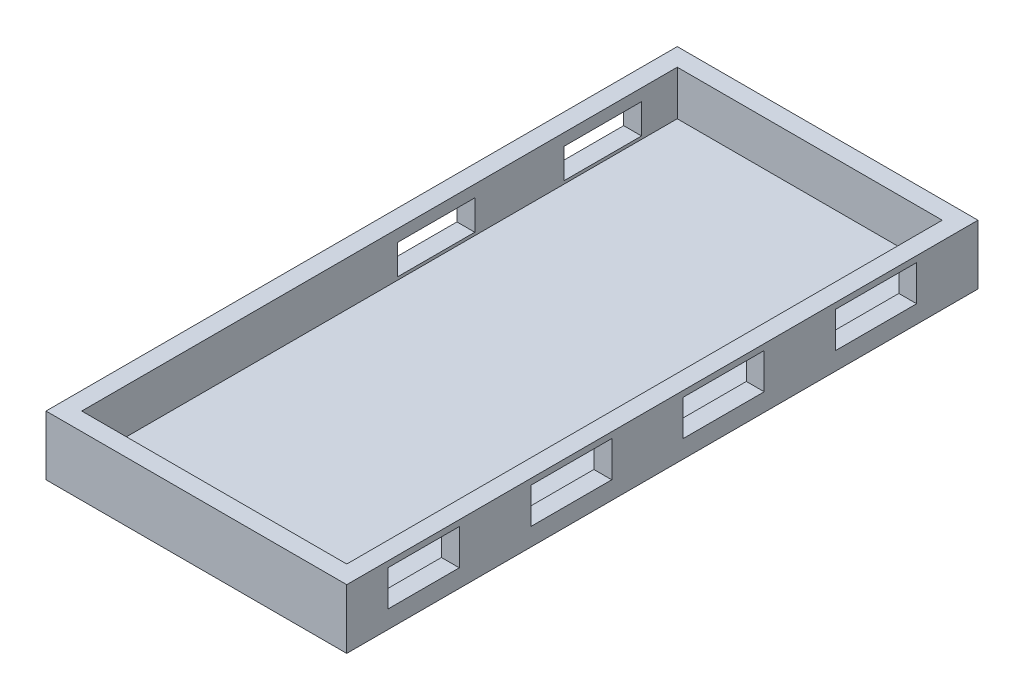
ISO-10303-21;
HEADER;
FILE_DESCRIPTION(('STEP AP214'),'2;1');
FILE_NAME('part.step','',(''),(''),'','','');
FILE_SCHEMA(('AUTOMOTIVE_DESIGN { 1 0 10303 214 1 1 1 1 }'));
ENDSEC;
DATA;
#1=APPLICATION_CONTEXT('core data for automotive mechanical design processes');
#2=APPLICATION_PROTOCOL_DEFINITION('international standard','automotive_design',2000,#1);
#3=PRODUCT_CONTEXT('',#1,'mechanical');
#4=PRODUCT('Part','Part','',(#3));
#5=PRODUCT_RELATED_PRODUCT_CATEGORY('part','',(#4));
#6=PRODUCT_DEFINITION_FORMATION('','',#4);
#7=PRODUCT_DEFINITION_CONTEXT('part definition',#1,'design');
#8=PRODUCT_DEFINITION('design','',#6,#7);
#9=PRODUCT_DEFINITION_SHAPE('','',#8);
#10=(LENGTH_UNIT() NAMED_UNIT(*) SI_UNIT(.MILLI.,.METRE.));
#11=(NAMED_UNIT(*) PLANE_ANGLE_UNIT() SI_UNIT($,.RADIAN.));
#12=(NAMED_UNIT(*) SI_UNIT($,.STERADIAN.) SOLID_ANGLE_UNIT());
#13=UNCERTAINTY_MEASURE_WITH_UNIT(LENGTH_MEASURE(1.E-05),#10,'distance_accuracy_value','');
#14=(GEOMETRIC_REPRESENTATION_CONTEXT(3) GLOBAL_UNCERTAINTY_ASSIGNED_CONTEXT((#13)) GLOBAL_UNIT_ASSIGNED_CONTEXT((#10,
#11,#12)) REPRESENTATION_CONTEXT('',''));
#15=CARTESIAN_POINT('',(0.,0.,0.));
#16=DIRECTION('',(0.,0.,1.));
#17=DIRECTION('',(1.,0.,0.));
#18=AXIS2_PLACEMENT_3D('',#15,#16,#17);
#19=CARTESIAN_POINT('',(-21.0145161290323,10.,-20.2));
#20=DIRECTION('',(1.,0.,0.));
#21=DIRECTION('',(0.,0.,-1.));
#22=AXIS2_PLACEMENT_3D('',#19,#20,#21);
#23=PLANE('',#22);
#24=DIRECTION('',(0.,0.,1.));
#25=VECTOR('',#24,1.);
#26=CARTESIAN_POINT('',(-21.0145161290323,3.,-11.2));
#27=LINE('',#26,#25);
#28=CARTESIAN_POINT('',(-21.0145161290323,3.,-11.2));
#29=VERTEX_POINT('',#28);
#30=CARTESIAN_POINT('',(-21.0145161290323,3.,1.80000000000004));
#31=VERTEX_POINT('',#30);
#32=EDGE_CURVE('E393',#29,#31,#27,.T.);
#33=ORIENTED_EDGE('',*,*,#32,.F.);
#34=DIRECTION('',(0.,-1.,0.));
#35=VECTOR('',#34,1.);
#36=CARTESIAN_POINT('',(-21.0145161290323,8.,-11.2));
#37=LINE('',#36,#35);
#38=CARTESIAN_POINT('',(-21.0145161290323,8.,-11.2));
#39=VERTEX_POINT('',#38);
#40=EDGE_CURVE('E391',#39,#29,#37,.T.);
#41=ORIENTED_EDGE('',*,*,#40,.F.);
#42=DIRECTION('',(0.,0.,-1.));
#43=VECTOR('',#42,1.);
#44=CARTESIAN_POINT('',(-21.0145161290323,8.,-11.2));
#45=LINE('',#44,#43);
#46=CARTESIAN_POINT('',(-21.0145161290323,8.,1.80000000000004));
#47=VERTEX_POINT('',#46);
#48=EDGE_CURVE('E381',#47,#39,#45,.T.);
#49=ORIENTED_EDGE('',*,*,#48,.F.);
#50=DIRECTION('',(0.,1.,0.));
#51=VECTOR('',#50,1.);
#52=CARTESIAN_POINT('',(-21.0145161290323,8.,1.80000000000004));
#53=LINE('',#52,#51);
#54=EDGE_CURVE('E397',#31,#47,#53,.T.);
#55=ORIENTED_EDGE('',*,*,#54,.F.);
#56=EDGE_LOOP('',(#33,#41,#49,#55));
#57=FACE_BOUND('',#56,.T.);
#58=DIRECTION('',(0.,0.,1.));
#59=VECTOR('',#58,1.);
#60=CARTESIAN_POINT('',(-21.0145161290323,3.,16.8));
#61=LINE('',#60,#59);
#62=CARTESIAN_POINT('',(-21.0145161290323,3.,16.8));
#63=VERTEX_POINT('',#62);
#64=CARTESIAN_POINT('',(-21.0145161290323,3.,29.8));
#65=VERTEX_POINT('',#64);
#66=EDGE_CURVE('E426',#63,#65,#61,.T.);
#67=ORIENTED_EDGE('',*,*,#66,.F.);
#68=DIRECTION('',(0.,-1.,0.));
#69=VECTOR('',#68,1.);
#70=CARTESIAN_POINT('',(-21.0145161290323,8.,16.8));
#71=LINE('',#70,#69);
#72=CARTESIAN_POINT('',(-21.0145161290323,8.,16.8));
#73=VERTEX_POINT('',#72);
#74=EDGE_CURVE('E280',#73,#63,#71,.T.);
#75=ORIENTED_EDGE('',*,*,#74,.F.);
#76=DIRECTION('',(0.,0.,-1.));
#77=VECTOR('',#76,1.);
#78=CARTESIAN_POINT('',(-21.0145161290323,8.,16.8));
#79=LINE('',#78,#77);
#80=CARTESIAN_POINT('',(-21.0145161290323,8.,29.8));
#81=VERTEX_POINT('',#80);
#82=EDGE_CURVE('E415',#81,#73,#79,.T.);
#83=ORIENTED_EDGE('',*,*,#82,.F.);
#84=DIRECTION('',(0.,1.,0.));
#85=VECTOR('',#84,1.);
#86=CARTESIAN_POINT('',(-21.0145161290323,8.,29.8));
#87=LINE('',#86,#85);
#88=EDGE_CURVE('E429',#65,#81,#87,.T.);
#89=ORIENTED_EDGE('',*,*,#88,.F.);
#90=EDGE_LOOP('',(#67,#75,#83,#89));
#91=FACE_BOUND('',#90,.T.);
#92=DIRECTION('',(0.,0.,1.));
#93=VECTOR('',#92,1.);
#94=CARTESIAN_POINT('',(-21.0145161290323,0.,-20.2));
#95=LINE('',#94,#93);
#96=CARTESIAN_POINT('',(-21.0145161290323,0.,-20.2));
#97=VERTEX_POINT('',#96);
#98=CARTESIAN_POINT('',(-21.0145161290323,0.,85.8));
#99=VERTEX_POINT('',#98);
#100=EDGE_CURVE('E466',#97,#99,#95,.T.);
#101=ORIENTED_EDGE('',*,*,#100,.T.);
#102=DIRECTION('',(0.,-1.,0.));
#103=VECTOR('',#102,1.);
#104=CARTESIAN_POINT('',(-21.0145161290323,10.,85.8));
#105=LINE('',#104,#103);
#106=CARTESIAN_POINT('',(-21.0145161290323,10.,85.8));
#107=VERTEX_POINT('',#106);
#108=EDGE_CURVE('E11',#107,#99,#105,.T.);
#109=ORIENTED_EDGE('',*,*,#108,.F.);
#110=DIRECTION('',(0.,0.,1.));
#111=VECTOR('',#110,1.);
#112=CARTESIAN_POINT('',(-21.0145161290323,10.,-20.2));
#113=LINE('',#112,#111);
#114=CARTESIAN_POINT('',(-21.0145161290323,10.,-20.2));
#115=VERTEX_POINT('',#114);
#116=EDGE_CURVE('E473',#115,#107,#113,.T.);
#117=ORIENTED_EDGE('',*,*,#116,.F.);
#118=DIRECTION('',(0.,-1.,0.));
#119=VECTOR('',#118,1.);
#120=CARTESIAN_POINT('',(-21.0145161290323,10.,-20.2));
#121=LINE('',#120,#119);
#122=EDGE_CURVE('E483',#115,#97,#121,.T.);
#123=ORIENTED_EDGE('',*,*,#122,.T.);
#124=EDGE_LOOP('',(#101,#109,#117,#123));
#125=FACE_BOUND('',#124,.T.);
#126=ADVANCED_FACE('F35',(#57,#91,#125),#23,.F.);
#127=CARTESIAN_POINT('',(-21.0145161290323,10.,85.8));
#128=DIRECTION('',(0.,0.,-1.));
#129=DIRECTION('',(-1.,0.,0.));
#130=AXIS2_PLACEMENT_3D('',#127,#128,#129);
#131=PLANE('',#130);
#132=DIRECTION('',(1.,0.,0.));
#133=VECTOR('',#132,1.);
#134=CARTESIAN_POINT('',(-21.0145161290323,0.,85.8));
#135=LINE('',#134,#133);
#136=CARTESIAN_POINT('',(29.4854838709677,0.,85.8));
#137=VERTEX_POINT('',#136);
#138=EDGE_CURVE('E486',#99,#137,#135,.T.);
#139=ORIENTED_EDGE('',*,*,#138,.T.);
#140=DIRECTION('',(0.,-1.,0.));
#141=VECTOR('',#140,1.);
#142=CARTESIAN_POINT('',(29.4854838709677,10.,85.8));
#143=LINE('',#142,#141);
#144=CARTESIAN_POINT('',(29.4854838709677,10.,85.8));
#145=VERTEX_POINT('',#144);
#146=EDGE_CURVE('E42',#145,#137,#143,.T.);
#147=ORIENTED_EDGE('',*,*,#146,.F.);
#148=DIRECTION('',(1.,0.,0.));
#149=VECTOR('',#148,1.);
#150=CARTESIAN_POINT('',(-21.0145161290323,10.,85.8));
#151=LINE('',#150,#149);
#152=EDGE_CURVE('E476',#107,#145,#151,.T.);
#153=ORIENTED_EDGE('',*,*,#152,.F.);
#154=ORIENTED_EDGE('',*,*,#108,.T.);
#155=EDGE_LOOP('',(#139,#147,#153,#154));
#156=FACE_BOUND('',#155,.T.);
#157=ADVANCED_FACE('F516',(#156),#131,.F.);
#158=CARTESIAN_POINT('',(29.4854838709677,10.,-20.2));
#159=DIRECTION('',(-1.,0.,0.));
#160=DIRECTION('',(0.,0.,1.));
#161=AXIS2_PLACEMENT_3D('',#158,#159,#160);
#162=PLANE('',#161);
#163=DIRECTION('',(0.,0.,-1.));
#164=VECTOR('',#163,1.);
#165=CARTESIAN_POINT('',(29.4854838709677,3.,3.70000000000004));
#166=LINE('',#165,#164);
#167=CARTESIAN_POINT('',(29.4854838709677,3.,3.70000000000004));
#168=VERTEX_POINT('',#167);
#169=CARTESIAN_POINT('',(29.4854838709677,3.,-9.89999999999996));
#170=VERTEX_POINT('',#169);
#171=EDGE_CURVE('E273',#168,#170,#166,.T.);
#172=ORIENTED_EDGE('',*,*,#171,.F.);
#173=DIRECTION('',(0.,-1.,0.));
#174=VECTOR('',#173,1.);
#175=CARTESIAN_POINT('',(29.4854838709677,9.,3.70000000000004));
#176=LINE('',#175,#174);
#177=CARTESIAN_POINT('',(29.4854838709677,9.,3.70000000000004));
#178=VERTEX_POINT('',#177);
#179=EDGE_CURVE('E49',#178,#168,#176,.T.);
#180=ORIENTED_EDGE('',*,*,#179,.F.);
#181=DIRECTION('',(0.,0.,1.));
#182=VECTOR('',#181,1.);
#183=CARTESIAN_POINT('',(29.4854838709677,9.,3.70000000000004));
#184=LINE('',#183,#182);
#185=CARTESIAN_POINT('',(29.4854838709677,9.,-9.89999999999996));
#186=VERTEX_POINT('',#185);
#187=EDGE_CURVE('E264',#186,#178,#184,.T.);
#188=ORIENTED_EDGE('',*,*,#187,.F.);
#189=DIRECTION('',(0.,1.,0.));
#190=VECTOR('',#189,1.);
#191=CARTESIAN_POINT('',(29.4854838709677,9.,-9.89999999999996));
#192=LINE('',#191,#190);
#193=EDGE_CURVE('E267',#170,#186,#192,.T.);
#194=ORIENTED_EDGE('',*,*,#193,.F.);
#195=EDGE_LOOP('',(#172,#180,#188,#194));
#196=FACE_BOUND('',#195,.T.);
#197=DIRECTION('',(0.,0.,-1.));
#198=VECTOR('',#197,1.);
#199=CARTESIAN_POINT('',(29.4854838709677,3.,29.3));
#200=LINE('',#199,#198);
#201=CARTESIAN_POINT('',(29.4854838709677,3.,29.3));
#202=VERTEX_POINT('',#201);
#203=CARTESIAN_POINT('',(29.4854838709677,3.,15.7));
#204=VERTEX_POINT('',#203);
#205=EDGE_CURVE('E299',#202,#204,#200,.T.);
#206=ORIENTED_EDGE('',*,*,#205,.F.);
#207=DIRECTION('',(0.,-1.,0.));
#208=VECTOR('',#207,1.);
#209=CARTESIAN_POINT('',(29.4854838709677,9.,29.3));
#210=LINE('',#209,#208);
#211=CARTESIAN_POINT('',(29.4854838709677,9.,29.3));
#212=VERTEX_POINT('',#211);
#213=EDGE_CURVE('E57',#212,#202,#210,.T.);
#214=ORIENTED_EDGE('',*,*,#213,.F.);
#215=DIRECTION('',(0.,0.,1.));
#216=VECTOR('',#215,1.);
#217=CARTESIAN_POINT('',(29.4854838709677,9.,29.3));
#218=LINE('',#217,#216);
#219=CARTESIAN_POINT('',(29.4854838709677,9.,15.7));
#220=VERTEX_POINT('',#219);
#221=EDGE_CURVE('E288',#220,#212,#218,.T.);
#222=ORIENTED_EDGE('',*,*,#221,.F.);
#223=DIRECTION('',(0.,1.,0.));
#224=VECTOR('',#223,1.);
#225=CARTESIAN_POINT('',(29.4854838709677,9.,15.7));
#226=LINE('',#225,#224);
#227=EDGE_CURVE('E303',#204,#220,#226,.T.);
#228=ORIENTED_EDGE('',*,*,#227,.F.);
#229=EDGE_LOOP('',(#206,#214,#222,#228));
#230=FACE_BOUND('',#229,.T.);
#231=DIRECTION('',(0.,0.,-1.));
#232=VECTOR('',#231,1.);
#233=CARTESIAN_POINT('',(29.4854838709677,3.,54.9));
#234=LINE('',#233,#232);
#235=CARTESIAN_POINT('',(29.4854838709677,3.,54.9));
#236=VERTEX_POINT('',#235);
#237=CARTESIAN_POINT('',(29.4854838709677,3.,41.3));
#238=VERTEX_POINT('',#237);
#239=EDGE_CURVE('E330',#236,#238,#234,.T.);
#240=ORIENTED_EDGE('',*,*,#239,.F.);
#241=DIRECTION('',(0.,-1.,0.));
#242=VECTOR('',#241,1.);
#243=CARTESIAN_POINT('',(29.4854838709677,9.,54.9));
#244=LINE('',#243,#242);
#245=CARTESIAN_POINT('',(29.4854838709677,9.,54.9));
#246=VERTEX_POINT('',#245);
#247=EDGE_CURVE('E328',#246,#236,#244,.T.);
#248=ORIENTED_EDGE('',*,*,#247,.F.);
#249=DIRECTION('',(0.,0.,1.));
#250=VECTOR('',#249,1.);
#251=CARTESIAN_POINT('',(29.4854838709677,9.,54.9));
#252=LINE('',#251,#250);
#253=CARTESIAN_POINT('',(29.4854838709677,9.,41.3));
#254=VERTEX_POINT('',#253);
#255=EDGE_CURVE('E318',#254,#246,#252,.T.);
#256=ORIENTED_EDGE('',*,*,#255,.F.);
#257=DIRECTION('',(0.,1.,0.));
#258=VECTOR('',#257,1.);
#259=CARTESIAN_POINT('',(29.4854838709677,9.,41.3));
#260=LINE('',#259,#258);
#261=EDGE_CURVE('E334',#238,#254,#260,.T.);
#262=ORIENTED_EDGE('',*,*,#261,.F.);
#263=EDGE_LOOP('',(#240,#248,#256,#262));
#264=FACE_BOUND('',#263,.T.);
#265=DIRECTION('',(0.,0.,-1.));
#266=VECTOR('',#265,1.);
#267=CARTESIAN_POINT('',(29.4854838709677,3.,78.9));
#268=LINE('',#267,#266);
#269=CARTESIAN_POINT('',(29.4854838709677,3.,78.9));
#270=VERTEX_POINT('',#269);
#271=CARTESIAN_POINT('',(29.4854838709677,3.,66.9));
#272=VERTEX_POINT('',#271);
#273=EDGE_CURVE('E362',#270,#272,#268,.T.);
#274=ORIENTED_EDGE('',*,*,#273,.F.);
#275=DIRECTION('',(0.,-1.,0.));
#276=VECTOR('',#275,1.);
#277=CARTESIAN_POINT('',(29.4854838709677,9.,78.9));
#278=LINE('',#277,#276);
#279=CARTESIAN_POINT('',(29.4854838709677,9.,78.9));
#280=VERTEX_POINT('',#279);
#281=EDGE_CURVE('E360',#280,#270,#278,.T.);
#282=ORIENTED_EDGE('',*,*,#281,.F.);
#283=DIRECTION('',(0.,0.,1.));
#284=VECTOR('',#283,1.);
#285=CARTESIAN_POINT('',(29.4854838709677,9.,78.9));
#286=LINE('',#285,#284);
#287=CARTESIAN_POINT('',(29.4854838709677,9.,66.9));
#288=VERTEX_POINT('',#287);
#289=EDGE_CURVE('E350',#288,#280,#286,.T.);
#290=ORIENTED_EDGE('',*,*,#289,.F.);
#291=DIRECTION('',(0.,1.,0.));
#292=VECTOR('',#291,1.);
#293=CARTESIAN_POINT('',(29.4854838709677,9.,66.9));
#294=LINE('',#293,#292);
#295=EDGE_CURVE('E365',#272,#288,#294,.T.);
#296=ORIENTED_EDGE('',*,*,#295,.F.);
#297=EDGE_LOOP('',(#274,#282,#290,#296));
#298=FACE_BOUND('',#297,.T.);
#299=DIRECTION('',(0.,0.,-1.));
#300=VECTOR('',#299,1.);
#301=CARTESIAN_POINT('',(29.4854838709677,0.,-20.2));
#302=LINE('',#301,#300);
#303=CARTESIAN_POINT('',(29.4854838709677,0.,-20.2));
#304=VERTEX_POINT('',#303);
#305=EDGE_CURVE('E488',#137,#304,#302,.T.);
#306=ORIENTED_EDGE('',*,*,#305,.T.);
#307=DIRECTION('',(0.,-1.,0.));
#308=VECTOR('',#307,1.);
#309=CARTESIAN_POINT('',(29.4854838709677,10.,-20.2));
#310=LINE('',#309,#308);
#311=CARTESIAN_POINT('',(29.4854838709677,10.,-20.2));
#312=VERTEX_POINT('',#311);
#313=EDGE_CURVE('E493',#312,#304,#310,.T.);
#314=ORIENTED_EDGE('',*,*,#313,.F.);
#315=DIRECTION('',(0.,0.,-1.));
#316=VECTOR('',#315,1.);
#317=CARTESIAN_POINT('',(29.4854838709677,10.,-20.2));
#318=LINE('',#317,#316);
#319=EDGE_CURVE('E479',#145,#312,#318,.T.);
#320=ORIENTED_EDGE('',*,*,#319,.F.);
#321=ORIENTED_EDGE('',*,*,#146,.T.);
#322=EDGE_LOOP('',(#306,#314,#320,#321));
#323=FACE_BOUND('',#322,.T.);
#324=ADVANCED_FACE('F500',(#196,#230,#264,#298,#323),#162,.F.);
#325=CARTESIAN_POINT('',(-21.0145161290323,10.,-20.2));
#326=DIRECTION('',(0.,0.,1.));
#327=DIRECTION('',(1.,0.,0.));
#328=AXIS2_PLACEMENT_3D('',#325,#326,#327);
#329=PLANE('',#328);
#330=DIRECTION('',(-1.,0.,0.));
#331=VECTOR('',#330,1.);
#332=CARTESIAN_POINT('',(-21.0145161290323,0.,-20.2));
#333=LINE('',#332,#331);
#334=EDGE_CURVE('E477',#304,#97,#333,.T.);
#335=ORIENTED_EDGE('',*,*,#334,.T.);
#336=ORIENTED_EDGE('',*,*,#122,.F.);
#337=DIRECTION('',(-1.,0.,0.));
#338=VECTOR('',#337,1.);
#339=CARTESIAN_POINT('',(-21.0145161290323,10.,-20.2));
#340=LINE('',#339,#338);
#341=EDGE_CURVE('E481',#312,#115,#340,.T.);
#342=ORIENTED_EDGE('',*,*,#341,.F.);
#343=ORIENTED_EDGE('',*,*,#313,.T.);
#344=EDGE_LOOP('',(#335,#336,#342,#343));
#345=FACE_BOUND('',#344,.T.);
#346=ADVANCED_FACE('F509',(#345),#329,.F.);
#347=CARTESIAN_POINT('',(0.,10.,0.));
#348=DIRECTION('',(0.,1.,0.));
#349=DIRECTION('',(0.,0.,1.));
#350=AXIS2_PLACEMENT_3D('',#347,#348,#349);
#351=PLANE('',#350);
#352=DIRECTION('',(0.,0.,1.));
#353=VECTOR('',#352,1.);
#354=CARTESIAN_POINT('',(-18.0145161290322,10.,-17.2));
#355=LINE('',#354,#353);
#356=CARTESIAN_POINT('',(-18.0145161290322,10.,-17.2));
#357=VERTEX_POINT('',#356);
#358=CARTESIAN_POINT('',(-18.0145161290322,10.,82.8000000000001));
#359=VERTEX_POINT('',#358);
#360=EDGE_CURVE('E404',#357,#359,#355,.T.);
#361=ORIENTED_EDGE('',*,*,#360,.F.);
#362=DIRECTION('',(-1.,0.,0.));
#363=VECTOR('',#362,1.);
#364=CARTESIAN_POINT('',(-18.0145161290322,10.,-17.2));
#365=LINE('',#364,#363);
#366=CARTESIAN_POINT('',(26.4854838709678,10.,-17.2));
#367=VERTEX_POINT('',#366);
#368=EDGE_CURVE('E445',#367,#357,#365,.T.);
#369=ORIENTED_EDGE('',*,*,#368,.F.);
#370=DIRECTION('',(0.,0.,-1.));
#371=VECTOR('',#370,1.);
#372=CARTESIAN_POINT('',(26.4854838709678,10.,-17.2));
#373=LINE('',#372,#371);
#374=CARTESIAN_POINT('',(26.4854838709678,10.,82.8000000000001));
#375=VERTEX_POINT('',#374);
#376=EDGE_CURVE('E459',#375,#367,#373,.T.);
#377=ORIENTED_EDGE('',*,*,#376,.F.);
#378=DIRECTION('',(1.,0.,0.));
#379=VECTOR('',#378,1.);
#380=CARTESIAN_POINT('',(-18.0145161290322,10.,82.8000000000001));
#381=LINE('',#380,#379);
#382=EDGE_CURVE('E456',#359,#375,#381,.T.);
#383=ORIENTED_EDGE('',*,*,#382,.F.);
#384=EDGE_LOOP('',(#361,#369,#377,#383));
#385=FACE_BOUND('',#384,.T.);
#386=ORIENTED_EDGE('',*,*,#116,.T.);
#387=ORIENTED_EDGE('',*,*,#152,.T.);
#388=ORIENTED_EDGE('',*,*,#319,.T.);
#389=ORIENTED_EDGE('',*,*,#341,.T.);
#390=EDGE_LOOP('',(#386,#387,#388,#389));
#391=FACE_BOUND('',#390,.T.);
#392=ADVANCED_FACE('F515',(#385,#391),#351,.T.);
#393=CARTESIAN_POINT('',(0.,0.,0.));
#394=DIRECTION('',(0.,1.,0.));
#395=DIRECTION('',(0.,0.,1.));
#396=AXIS2_PLACEMENT_3D('',#393,#394,#395);
#397=PLANE('',#396);
#398=ORIENTED_EDGE('',*,*,#100,.F.);
#399=ORIENTED_EDGE('',*,*,#334,.F.);
#400=ORIENTED_EDGE('',*,*,#305,.F.);
#401=ORIENTED_EDGE('',*,*,#138,.F.);
#402=EDGE_LOOP('',(#398,#399,#400,#401));
#403=FACE_BOUND('',#402,.T.);
#404=ADVANCED_FACE('F506',(#403),#397,.F.);
#405=CARTESIAN_POINT('',(-18.0145161290322,2.5,-17.2));
#406=DIRECTION('',(-1.,0.,0.));
#407=DIRECTION('',(0.,0.,1.));
#408=AXIS2_PLACEMENT_3D('',#405,#406,#407);
#409=PLANE('',#408);
#410=DIRECTION('',(0.,0.,-1.));
#411=VECTOR('',#410,1.);
#412=CARTESIAN_POINT('',(-18.0145161290323,8.,-11.2));
#413=LINE('',#412,#411);
#414=CARTESIAN_POINT('',(-18.0145161290323,8.,1.80000000000004));
#415=VERTEX_POINT('',#414);
#416=CARTESIAN_POINT('',(-18.0145161290323,8.,-11.2));
#417=VERTEX_POINT('',#416);
#418=EDGE_CURVE('E387',#415,#417,#413,.T.);
#419=ORIENTED_EDGE('',*,*,#418,.T.);
#420=DIRECTION('',(0.,-1.,0.));
#421=VECTOR('',#420,1.);
#422=CARTESIAN_POINT('',(-18.0145161290323,8.,-11.2));
#423=LINE('',#422,#421);
#424=CARTESIAN_POINT('',(-18.0145161290323,3.,-11.2));
#425=VERTEX_POINT('',#424);
#426=EDGE_CURVE('E377',#417,#425,#423,.T.);
#427=ORIENTED_EDGE('',*,*,#426,.T.);
#428=DIRECTION('',(0.,0.,1.));
#429=VECTOR('',#428,1.);
#430=CARTESIAN_POINT('',(-18.0145161290323,3.,-11.2));
#431=LINE('',#430,#429);
#432=CARTESIAN_POINT('',(-18.0145161290322,3.,1.80000000000004));
#433=VERTEX_POINT('',#432);
#434=EDGE_CURVE('E380',#425,#433,#431,.T.);
#435=ORIENTED_EDGE('',*,*,#434,.T.);
#436=DIRECTION('',(0.,1.,0.));
#437=VECTOR('',#436,1.);
#438=CARTESIAN_POINT('',(-18.0145161290323,8.,1.80000000000004));
#439=LINE('',#438,#437);
#440=EDGE_CURVE('E384',#433,#415,#439,.T.);
#441=ORIENTED_EDGE('',*,*,#440,.T.);
#442=EDGE_LOOP('',(#419,#427,#435,#441));
#443=FACE_BOUND('',#442,.T.);
#444=DIRECTION('',(0.,0.,-1.));
#445=VECTOR('',#444,1.);
#446=CARTESIAN_POINT('',(-18.0145161290323,8.,16.8));
#447=LINE('',#446,#445);
#448=CARTESIAN_POINT('',(-18.0145161290323,8.,29.8));
#449=VERTEX_POINT('',#448);
#450=CARTESIAN_POINT('',(-18.0145161290323,8.,16.8));
#451=VERTEX_POINT('',#450);
#452=EDGE_CURVE('E421',#449,#451,#447,.T.);
#453=ORIENTED_EDGE('',*,*,#452,.T.);
#454=DIRECTION('',(0.,-1.,0.));
#455=VECTOR('',#454,1.);
#456=CARTESIAN_POINT('',(-18.0145161290323,8.,16.8));
#457=LINE('',#456,#455);
#458=CARTESIAN_POINT('',(-18.0145161290323,3.,16.8));
#459=VERTEX_POINT('',#458);
#460=EDGE_CURVE('E411',#451,#459,#457,.T.);
#461=ORIENTED_EDGE('',*,*,#460,.T.);
#462=DIRECTION('',(0.,0.,1.));
#463=VECTOR('',#462,1.);
#464=CARTESIAN_POINT('',(-18.0145161290323,3.,16.8));
#465=LINE('',#464,#463);
#466=CARTESIAN_POINT('',(-18.0145161290322,3.,29.8));
#467=VERTEX_POINT('',#466);
#468=EDGE_CURVE('E414',#459,#467,#465,.T.);
#469=ORIENTED_EDGE('',*,*,#468,.T.);
#470=DIRECTION('',(0.,1.,0.));
#471=VECTOR('',#470,1.);
#472=CARTESIAN_POINT('',(-18.0145161290323,8.,29.8));
#473=LINE('',#472,#471);
#474=EDGE_CURVE('E418',#467,#449,#473,.T.);
#475=ORIENTED_EDGE('',*,*,#474,.T.);
#476=EDGE_LOOP('',(#453,#461,#469,#475));
#477=FACE_BOUND('',#476,.T.);
#478=ORIENTED_EDGE('',*,*,#360,.T.);
#479=DIRECTION('',(0.,1.,0.));
#480=VECTOR('',#479,1.);
#481=CARTESIAN_POINT('',(-18.0145161290322,2.5,82.8000000000001));
#482=LINE('',#481,#480);
#483=CARTESIAN_POINT('',(-18.0145161290322,2.5,82.8000000000001));
#484=VERTEX_POINT('',#483);
#485=EDGE_CURVE('E454',#484,#359,#482,.T.);
#486=ORIENTED_EDGE('',*,*,#485,.F.);
#487=DIRECTION('',(0.,0.,1.));
#488=VECTOR('',#487,1.);
#489=CARTESIAN_POINT('',(-18.0145161290322,2.5,-17.2));
#490=LINE('',#489,#488);
#491=CARTESIAN_POINT('',(-18.0145161290322,2.5,-17.2));
#492=VERTEX_POINT('',#491);
#493=EDGE_CURVE('E441',#492,#484,#490,.T.);
#494=ORIENTED_EDGE('',*,*,#493,.F.);
#495=DIRECTION('',(0.,1.,0.));
#496=VECTOR('',#495,1.);
#497=CARTESIAN_POINT('',(-18.0145161290322,2.5,-17.2));
#498=LINE('',#497,#496);
#499=EDGE_CURVE('E464',#492,#357,#498,.T.);
#500=ORIENTED_EDGE('',*,*,#499,.T.);
#501=EDGE_LOOP('',(#478,#486,#494,#500));
#502=FACE_BOUND('',#501,.T.);
#503=ADVANCED_FACE('F530',(#443,#477,#502),#409,.F.);
#504=CARTESIAN_POINT('',(-18.0145161290322,2.5,-17.2));
#505=DIRECTION('',(0.,0.,-1.));
#506=DIRECTION('',(-1.,0.,0.));
#507=AXIS2_PLACEMENT_3D('',#504,#505,#506);
#508=PLANE('',#507);
#509=ORIENTED_EDGE('',*,*,#368,.T.);
#510=ORIENTED_EDGE('',*,*,#499,.F.);
#511=DIRECTION('',(-1.,0.,0.));
#512=VECTOR('',#511,1.);
#513=CARTESIAN_POINT('',(-18.0145161290322,2.5,-17.2));
#514=LINE('',#513,#512);
#515=CARTESIAN_POINT('',(26.4854838709678,2.5,-17.2));
#516=VERTEX_POINT('',#515);
#517=EDGE_CURVE('E451',#516,#492,#514,.T.);
#518=ORIENTED_EDGE('',*,*,#517,.F.);
#519=DIRECTION('',(0.,1.,0.));
#520=VECTOR('',#519,1.);
#521=CARTESIAN_POINT('',(26.4854838709678,2.5,-17.2));
#522=LINE('',#521,#520);
#523=EDGE_CURVE('E467',#516,#367,#522,.T.);
#524=ORIENTED_EDGE('',*,*,#523,.T.);
#525=EDGE_LOOP('',(#509,#510,#518,#524));
#526=FACE_BOUND('',#525,.T.);
#527=ADVANCED_FACE('F536',(#526),#508,.F.);
#528=CARTESIAN_POINT('',(26.4854838709678,2.5,-17.2));
#529=DIRECTION('',(1.,0.,0.));
#530=DIRECTION('',(0.,0.,-1.));
#531=AXIS2_PLACEMENT_3D('',#528,#529,#530);
#532=PLANE('',#531);
#533=DIRECTION('',(0.,0.,1.));
#534=VECTOR('',#533,1.);
#535=CARTESIAN_POINT('',(26.4854838709677,9.,3.70000000000004));
#536=LINE('',#535,#534);
#537=CARTESIAN_POINT('',(26.4854838709677,9.,-9.89999999999996));
#538=VERTEX_POINT('',#537);
#539=CARTESIAN_POINT('',(26.4854838709677,9.,3.70000000000004));
#540=VERTEX_POINT('',#539);
#541=EDGE_CURVE('E251',#538,#540,#536,.T.);
#542=ORIENTED_EDGE('',*,*,#541,.T.);
#543=DIRECTION('',(0.,-1.,0.));
#544=VECTOR('',#543,1.);
#545=CARTESIAN_POINT('',(26.4854838709677,9.,3.70000000000004));
#546=LINE('',#545,#544);
#547=CARTESIAN_POINT('',(26.4854838709677,3.,3.70000000000004));
#548=VERTEX_POINT('',#547);
#549=EDGE_CURVE('E245',#540,#548,#546,.T.);
#550=ORIENTED_EDGE('',*,*,#549,.T.);
#551=DIRECTION('',(0.,0.,-1.));
#552=VECTOR('',#551,1.);
#553=CARTESIAN_POINT('',(26.4854838709677,3.,3.70000000000004));
#554=LINE('',#553,#552);
#555=CARTESIAN_POINT('',(26.4854838709678,3.,-9.89999999999996));
#556=VERTEX_POINT('',#555);
#557=EDGE_CURVE('E255',#548,#556,#554,.T.);
#558=ORIENTED_EDGE('',*,*,#557,.T.);
#559=DIRECTION('',(0.,1.,0.));
#560=VECTOR('',#559,1.);
#561=CARTESIAN_POINT('',(26.4854838709677,9.,-9.89999999999996));
#562=LINE('',#561,#560);
#563=EDGE_CURVE('E259',#556,#538,#562,.T.);
#564=ORIENTED_EDGE('',*,*,#563,.T.);
#565=EDGE_LOOP('',(#542,#550,#558,#564));
#566=FACE_BOUND('',#565,.T.);
#567=DIRECTION('',(0.,0.,1.));
#568=VECTOR('',#567,1.);
#569=CARTESIAN_POINT('',(26.4854838709677,9.,29.3));
#570=LINE('',#569,#568);
#571=CARTESIAN_POINT('',(26.4854838709677,9.,15.7));
#572=VERTEX_POINT('',#571);
#573=CARTESIAN_POINT('',(26.4854838709677,9.,29.3));
#574=VERTEX_POINT('',#573);
#575=EDGE_CURVE('E294',#572,#574,#570,.T.);
#576=ORIENTED_EDGE('',*,*,#575,.T.);
#577=DIRECTION('',(0.,-1.,0.));
#578=VECTOR('',#577,1.);
#579=CARTESIAN_POINT('',(26.4854838709677,9.,29.3));
#580=LINE('',#579,#578);
#581=CARTESIAN_POINT('',(26.4854838709677,3.,29.3));
#582=VERTEX_POINT('',#581);
#583=EDGE_CURVE('E284',#574,#582,#580,.T.);
#584=ORIENTED_EDGE('',*,*,#583,.T.);
#585=DIRECTION('',(0.,0.,-1.));
#586=VECTOR('',#585,1.);
#587=CARTESIAN_POINT('',(26.4854838709677,3.,29.3));
#588=LINE('',#587,#586);
#589=CARTESIAN_POINT('',(26.4854838709678,3.,15.7));
#590=VERTEX_POINT('',#589);
#591=EDGE_CURVE('E287',#582,#590,#588,.T.);
#592=ORIENTED_EDGE('',*,*,#591,.T.);
#593=DIRECTION('',(0.,1.,0.));
#594=VECTOR('',#593,1.);
#595=CARTESIAN_POINT('',(26.4854838709677,9.,15.7));
#596=LINE('',#595,#594);
#597=EDGE_CURVE('E291',#590,#572,#596,.T.);
#598=ORIENTED_EDGE('',*,*,#597,.T.);
#599=EDGE_LOOP('',(#576,#584,#592,#598));
#600=FACE_BOUND('',#599,.T.);
#601=DIRECTION('',(0.,0.,1.));
#602=VECTOR('',#601,1.);
#603=CARTESIAN_POINT('',(26.4854838709677,9.,54.9));
#604=LINE('',#603,#602);
#605=CARTESIAN_POINT('',(26.4854838709677,9.,41.3));
#606=VERTEX_POINT('',#605);
#607=CARTESIAN_POINT('',(26.4854838709677,9.,54.9));
#608=VERTEX_POINT('',#607);
#609=EDGE_CURVE('E324',#606,#608,#604,.T.);
#610=ORIENTED_EDGE('',*,*,#609,.T.);
#611=DIRECTION('',(0.,-1.,0.));
#612=VECTOR('',#611,1.);
#613=CARTESIAN_POINT('',(26.4854838709677,9.,54.9));
#614=LINE('',#613,#612);
#615=CARTESIAN_POINT('',(26.4854838709677,3.,54.9));
#616=VERTEX_POINT('',#615);
#617=EDGE_CURVE('E314',#608,#616,#614,.T.);
#618=ORIENTED_EDGE('',*,*,#617,.T.);
#619=DIRECTION('',(0.,0.,-1.));
#620=VECTOR('',#619,1.);
#621=CARTESIAN_POINT('',(26.4854838709677,3.,54.9));
#622=LINE('',#621,#620);
#623=CARTESIAN_POINT('',(26.4854838709678,3.,41.3));
#624=VERTEX_POINT('',#623);
#625=EDGE_CURVE('E317',#616,#624,#622,.T.);
#626=ORIENTED_EDGE('',*,*,#625,.T.);
#627=DIRECTION('',(0.,1.,0.));
#628=VECTOR('',#627,1.);
#629=CARTESIAN_POINT('',(26.4854838709677,9.,41.3));
#630=LINE('',#629,#628);
#631=EDGE_CURVE('E321',#624,#606,#630,.T.);
#632=ORIENTED_EDGE('',*,*,#631,.T.);
#633=EDGE_LOOP('',(#610,#618,#626,#632));
#634=FACE_BOUND('',#633,.T.);
#635=DIRECTION('',(0.,0.,1.));
#636=VECTOR('',#635,1.);
#637=CARTESIAN_POINT('',(26.4854838709678,9.,78.9));
#638=LINE('',#637,#636);
#639=CARTESIAN_POINT('',(26.4854838709677,9.,66.9));
#640=VERTEX_POINT('',#639);
#641=CARTESIAN_POINT('',(26.4854838709678,9.,78.9));
#642=VERTEX_POINT('',#641);
#643=EDGE_CURVE('E356',#640,#642,#638,.T.);
#644=ORIENTED_EDGE('',*,*,#643,.T.);
#645=DIRECTION('',(0.,-1.,0.));
#646=VECTOR('',#645,1.);
#647=CARTESIAN_POINT('',(26.4854838709678,9.,78.9));
#648=LINE('',#647,#646);
#649=CARTESIAN_POINT('',(26.4854838709678,3.,78.9));
#650=VERTEX_POINT('',#649);
#651=EDGE_CURVE('E346',#642,#650,#648,.T.);
#652=ORIENTED_EDGE('',*,*,#651,.T.);
#653=DIRECTION('',(0.,0.,-1.));
#654=VECTOR('',#653,1.);
#655=CARTESIAN_POINT('',(26.4854838709678,3.,78.9));
#656=LINE('',#655,#654);
#657=CARTESIAN_POINT('',(26.4854838709678,3.,66.9));
#658=VERTEX_POINT('',#657);
#659=EDGE_CURVE('E349',#650,#658,#656,.T.);
#660=ORIENTED_EDGE('',*,*,#659,.T.);
#661=DIRECTION('',(0.,1.,0.));
#662=VECTOR('',#661,1.);
#663=CARTESIAN_POINT('',(26.4854838709677,9.,66.9));
#664=LINE('',#663,#662);
#665=EDGE_CURVE('E353',#658,#640,#664,.T.);
#666=ORIENTED_EDGE('',*,*,#665,.T.);
#667=EDGE_LOOP('',(#644,#652,#660,#666));
#668=FACE_BOUND('',#667,.T.);
#669=ORIENTED_EDGE('',*,*,#376,.T.);
#670=ORIENTED_EDGE('',*,*,#523,.F.);
#671=DIRECTION('',(0.,0.,-1.));
#672=VECTOR('',#671,1.);
#673=CARTESIAN_POINT('',(26.4854838709678,2.5,-17.2));
#674=LINE('',#673,#672);
#675=CARTESIAN_POINT('',(26.4854838709678,2.5,82.8000000000001));
#676=VERTEX_POINT('',#675);
#677=EDGE_CURVE('E448',#676,#516,#674,.T.);
#678=ORIENTED_EDGE('',*,*,#677,.F.);
#679=DIRECTION('',(0.,1.,0.));
#680=VECTOR('',#679,1.);
#681=CARTESIAN_POINT('',(26.4854838709678,2.5,82.8000000000001));
#682=LINE('',#681,#680);
#683=EDGE_CURVE('E469',#676,#375,#682,.T.);
#684=ORIENTED_EDGE('',*,*,#683,.T.);
#685=EDGE_LOOP('',(#669,#670,#678,#684));
#686=FACE_BOUND('',#685,.T.);
#687=ADVANCED_FACE('F261',(#566,#600,#634,#668,#686),#532,.F.);
#688=CARTESIAN_POINT('',(-18.0145161290322,2.5,82.8000000000001));
#689=DIRECTION('',(0.,0.,1.));
#690=DIRECTION('',(1.,0.,0.));
#691=AXIS2_PLACEMENT_3D('',#688,#689,#690);
#692=PLANE('',#691);
#693=ORIENTED_EDGE('',*,*,#382,.T.);
#694=ORIENTED_EDGE('',*,*,#683,.F.);
#695=DIRECTION('',(1.,0.,0.));
#696=VECTOR('',#695,1.);
#697=CARTESIAN_POINT('',(-18.0145161290322,2.5,82.8000000000001));
#698=LINE('',#697,#696);
#699=EDGE_CURVE('E444',#484,#676,#698,.T.);
#700=ORIENTED_EDGE('',*,*,#699,.F.);
#701=ORIENTED_EDGE('',*,*,#485,.T.);
#702=EDGE_LOOP('',(#693,#694,#700,#701));
#703=FACE_BOUND('',#702,.T.);
#704=ADVANCED_FACE('F538',(#703),#692,.F.);
#705=CARTESIAN_POINT('',(0.,2.5,0.));
#706=DIRECTION('',(0.,1.,0.));
#707=DIRECTION('',(0.,0.,1.));
#708=AXIS2_PLACEMENT_3D('',#705,#706,#707);
#709=PLANE('',#708);
#710=ORIENTED_EDGE('',*,*,#493,.T.);
#711=ORIENTED_EDGE('',*,*,#699,.T.);
#712=ORIENTED_EDGE('',*,*,#677,.T.);
#713=ORIENTED_EDGE('',*,*,#517,.T.);
#714=EDGE_LOOP('',(#710,#711,#712,#713));
#715=FACE_BOUND('',#714,.T.);
#716=ADVANCED_FACE('F541',(#715),#709,.T.);
#717=CARTESIAN_POINT('',(-18.0145161290323,8.,16.8));
#718=DIRECTION('',(0.,0.,-1.));
#719=DIRECTION('',(-1.,0.,0.));
#720=AXIS2_PLACEMENT_3D('',#717,#718,#719);
#721=PLANE('',#720);
#722=ORIENTED_EDGE('',*,*,#74,.T.);
#723=DIRECTION('',(-1.,0.,0.));
#724=VECTOR('',#723,1.);
#725=CARTESIAN_POINT('',(-18.0145161290323,3.,16.8));
#726=LINE('',#725,#724);
#727=EDGE_CURVE('E424',#459,#63,#726,.T.);
#728=ORIENTED_EDGE('',*,*,#727,.F.);
#729=ORIENTED_EDGE('',*,*,#460,.F.);
#730=DIRECTION('',(-1.,0.,0.));
#731=VECTOR('',#730,1.);
#732=CARTESIAN_POINT('',(-18.0145161290323,8.,16.8));
#733=LINE('',#732,#731);
#734=EDGE_CURVE('E394',#451,#73,#733,.T.);
#735=ORIENTED_EDGE('',*,*,#734,.T.);
#736=EDGE_LOOP('',(#722,#728,#729,#735));
#737=FACE_BOUND('',#736,.T.);
#738=ADVANCED_FACE('F550',(#737),#721,.F.);
#739=CARTESIAN_POINT('',(-18.0145161290323,8.,16.8));
#740=DIRECTION('',(0.,1.,0.));
#741=DIRECTION('',(0.,0.,1.));
#742=AXIS2_PLACEMENT_3D('',#739,#740,#741);
#743=PLANE('',#742);
#744=ORIENTED_EDGE('',*,*,#82,.T.);
#745=ORIENTED_EDGE('',*,*,#734,.F.);
#746=ORIENTED_EDGE('',*,*,#452,.F.);
#747=DIRECTION('',(-1.,0.,0.));
#748=VECTOR('',#747,1.);
#749=CARTESIAN_POINT('',(-18.0145161290323,8.,29.8));
#750=LINE('',#749,#748);
#751=EDGE_CURVE('E435',#449,#81,#750,.T.);
#752=ORIENTED_EDGE('',*,*,#751,.T.);
#753=EDGE_LOOP('',(#744,#745,#746,#752));
#754=FACE_BOUND('',#753,.T.);
#755=ADVANCED_FACE('F554',(#754),#743,.F.);
#756=CARTESIAN_POINT('',(-18.0145161290323,8.,29.8));
#757=DIRECTION('',(0.,0.,1.));
#758=DIRECTION('',(1.,0.,0.));
#759=AXIS2_PLACEMENT_3D('',#756,#757,#758);
#760=PLANE('',#759);
#761=ORIENTED_EDGE('',*,*,#88,.T.);
#762=ORIENTED_EDGE('',*,*,#751,.F.);
#763=ORIENTED_EDGE('',*,*,#474,.F.);
#764=DIRECTION('',(-1.,0.,0.));
#765=VECTOR('',#764,1.);
#766=CARTESIAN_POINT('',(-18.0145161290323,3.,29.8));
#767=LINE('',#766,#765);
#768=EDGE_CURVE('E437',#467,#65,#767,.T.);
#769=ORIENTED_EDGE('',*,*,#768,.T.);
#770=EDGE_LOOP('',(#761,#762,#763,#769));
#771=FACE_BOUND('',#770,.T.);
#772=ADVANCED_FACE('F560',(#771),#760,.F.);
#773=CARTESIAN_POINT('',(-18.0145161290323,3.,16.8));
#774=DIRECTION('',(0.,-1.,0.));
#775=DIRECTION('',(0.,0.,-1.));
#776=AXIS2_PLACEMENT_3D('',#773,#774,#775);
#777=PLANE('',#776);
#778=ORIENTED_EDGE('',*,*,#66,.T.);
#779=ORIENTED_EDGE('',*,*,#768,.F.);
#780=ORIENTED_EDGE('',*,*,#468,.F.);
#781=ORIENTED_EDGE('',*,*,#727,.T.);
#782=EDGE_LOOP('',(#778,#779,#780,#781));
#783=FACE_BOUND('',#782,.T.);
#784=ADVANCED_FACE('F556',(#783),#777,.F.);
#785=CARTESIAN_POINT('',(-18.0145161290323,8.,-11.2));
#786=DIRECTION('',(0.,0.,-1.));
#787=DIRECTION('',(0.,1.,0.));
#788=AXIS2_PLACEMENT_3D('',#785,#786,#787);
#789=PLANE('',#788);
#790=ORIENTED_EDGE('',*,*,#40,.T.);
#791=DIRECTION('',(-1.,0.,0.));
#792=VECTOR('',#791,1.);
#793=CARTESIAN_POINT('',(-18.0145161290323,3.,-11.2));
#794=LINE('',#793,#792);
#795=EDGE_CURVE('E390',#425,#29,#794,.T.);
#796=ORIENTED_EDGE('',*,*,#795,.F.);
#797=ORIENTED_EDGE('',*,*,#426,.F.);
#798=DIRECTION('',(-1.,0.,0.));
#799=VECTOR('',#798,1.);
#800=CARTESIAN_POINT('',(-18.0145161290323,8.,-11.2));
#801=LINE('',#800,#799);
#802=EDGE_CURVE('E402',#417,#39,#801,.T.);
#803=ORIENTED_EDGE('',*,*,#802,.T.);
#804=EDGE_LOOP('',(#790,#796,#797,#803));
#805=FACE_BOUND('',#804,.T.);
#806=ADVANCED_FACE('F559',(#805),#789,.F.);
#807=CARTESIAN_POINT('',(-18.0145161290323,8.,-11.2));
#808=DIRECTION('',(0.,1.,0.));
#809=DIRECTION('',(0.,0.,1.));
#810=AXIS2_PLACEMENT_3D('',#807,#808,#809);
#811=PLANE('',#810);
#812=ORIENTED_EDGE('',*,*,#48,.T.);
#813=ORIENTED_EDGE('',*,*,#802,.F.);
#814=ORIENTED_EDGE('',*,*,#418,.F.);
#815=DIRECTION('',(-1.,0.,0.));
#816=VECTOR('',#815,1.);
#817=CARTESIAN_POINT('',(-18.0145161290323,8.,1.80000000000004));
#818=LINE('',#817,#816);
#819=EDGE_CURVE('E405',#415,#47,#818,.T.);
#820=ORIENTED_EDGE('',*,*,#819,.T.);
#821=EDGE_LOOP('',(#812,#813,#814,#820));
#822=FACE_BOUND('',#821,.T.);
#823=ADVANCED_FACE('F570',(#822),#811,.F.);
#824=CARTESIAN_POINT('',(-18.0145161290323,8.,1.80000000000004));
#825=DIRECTION('',(0.,0.,1.));
#826=DIRECTION('',(0.,-1.,0.));
#827=AXIS2_PLACEMENT_3D('',#824,#825,#826);
#828=PLANE('',#827);
#829=ORIENTED_EDGE('',*,*,#54,.T.);
#830=ORIENTED_EDGE('',*,*,#819,.F.);
#831=ORIENTED_EDGE('',*,*,#440,.F.);
#832=DIRECTION('',(-1.,0.,0.));
#833=VECTOR('',#832,1.);
#834=CARTESIAN_POINT('',(-18.0145161290323,3.,1.80000000000004));
#835=LINE('',#834,#833);
#836=EDGE_CURVE('E407',#433,#31,#835,.T.);
#837=ORIENTED_EDGE('',*,*,#836,.T.);
#838=EDGE_LOOP('',(#829,#830,#831,#837));
#839=FACE_BOUND('',#838,.T.);
#840=ADVANCED_FACE('F576',(#839),#828,.F.);
#841=CARTESIAN_POINT('',(-18.0145161290323,3.,-11.2));
#842=DIRECTION('',(0.,-1.,0.));
#843=DIRECTION('',(0.,0.,-1.));
#844=AXIS2_PLACEMENT_3D('',#841,#842,#843);
#845=PLANE('',#844);
#846=ORIENTED_EDGE('',*,*,#32,.T.);
#847=ORIENTED_EDGE('',*,*,#836,.F.);
#848=ORIENTED_EDGE('',*,*,#434,.F.);
#849=ORIENTED_EDGE('',*,*,#795,.T.);
#850=EDGE_LOOP('',(#846,#847,#848,#849));
#851=FACE_BOUND('',#850,.T.);
#852=ADVANCED_FACE('F572',(#851),#845,.F.);
#853=CARTESIAN_POINT('',(26.4854838709678,9.,78.9));
#854=DIRECTION('',(0.,0.,1.));
#855=DIRECTION('',(1.,0.,0.));
#856=AXIS2_PLACEMENT_3D('',#853,#854,#855);
#857=PLANE('',#856);
#858=ORIENTED_EDGE('',*,*,#281,.T.);
#859=DIRECTION('',(1.,0.,0.));
#860=VECTOR('',#859,1.);
#861=CARTESIAN_POINT('',(26.4854838709678,3.,78.9));
#862=LINE('',#861,#860);
#863=EDGE_CURVE('E359',#650,#270,#862,.T.);
#864=ORIENTED_EDGE('',*,*,#863,.F.);
#865=ORIENTED_EDGE('',*,*,#651,.F.);
#866=DIRECTION('',(1.,0.,0.));
#867=VECTOR('',#866,1.);
#868=CARTESIAN_POINT('',(26.4854838709678,9.,78.9));
#869=LINE('',#868,#867);
#870=EDGE_CURVE('E331',#642,#280,#869,.T.);
#871=ORIENTED_EDGE('',*,*,#870,.T.);
#872=EDGE_LOOP('',(#858,#864,#865,#871));
#873=FACE_BOUND('',#872,.T.);
#874=ADVANCED_FACE('F575',(#873),#857,.F.);
#875=CARTESIAN_POINT('',(26.4854838709678,9.,78.9));
#876=DIRECTION('',(0.,1.,0.));
#877=DIRECTION('',(0.,0.,1.));
#878=AXIS2_PLACEMENT_3D('',#875,#876,#877);
#879=PLANE('',#878);
#880=ORIENTED_EDGE('',*,*,#289,.T.);
#881=ORIENTED_EDGE('',*,*,#870,.F.);
#882=ORIENTED_EDGE('',*,*,#643,.F.);
#883=DIRECTION('',(1.,0.,0.));
#884=VECTOR('',#883,1.);
#885=CARTESIAN_POINT('',(26.4854838709677,9.,66.9));
#886=LINE('',#885,#884);
#887=EDGE_CURVE('E371',#640,#288,#886,.T.);
#888=ORIENTED_EDGE('',*,*,#887,.T.);
#889=EDGE_LOOP('',(#880,#881,#882,#888));
#890=FACE_BOUND('',#889,.T.);
#891=ADVANCED_FACE('F586',(#890),#879,.F.);
#892=CARTESIAN_POINT('',(26.4854838709677,9.,66.9));
#893=DIRECTION('',(0.,0.,-1.));
#894=DIRECTION('',(-1.,0.,0.));
#895=AXIS2_PLACEMENT_3D('',#892,#893,#894);
#896=PLANE('',#895);
#897=ORIENTED_EDGE('',*,*,#295,.T.);
#898=ORIENTED_EDGE('',*,*,#887,.F.);
#899=ORIENTED_EDGE('',*,*,#665,.F.);
#900=DIRECTION('',(1.,0.,0.));
#901=VECTOR('',#900,1.);
#902=CARTESIAN_POINT('',(26.4854838709677,3.,66.9));
#903=LINE('',#902,#901);
#904=EDGE_CURVE('E373',#658,#272,#903,.T.);
#905=ORIENTED_EDGE('',*,*,#904,.T.);
#906=EDGE_LOOP('',(#897,#898,#899,#905));
#907=FACE_BOUND('',#906,.T.);
#908=ADVANCED_FACE('F592',(#907),#896,.F.);
#909=CARTESIAN_POINT('',(26.4854838709678,3.,78.9));
#910=DIRECTION('',(0.,-1.,0.));
#911=DIRECTION('',(0.,0.,-1.));
#912=AXIS2_PLACEMENT_3D('',#909,#910,#911);
#913=PLANE('',#912);
#914=ORIENTED_EDGE('',*,*,#273,.T.);
#915=ORIENTED_EDGE('',*,*,#904,.F.);
#916=ORIENTED_EDGE('',*,*,#659,.F.);
#917=ORIENTED_EDGE('',*,*,#863,.T.);
#918=EDGE_LOOP('',(#914,#915,#916,#917));
#919=FACE_BOUND('',#918,.T.);
#920=ADVANCED_FACE('F588',(#919),#913,.F.);
#921=CARTESIAN_POINT('',(26.4854838709677,9.,54.9));
#922=DIRECTION('',(0.,0.,1.));
#923=DIRECTION('',(1.,0.,0.));
#924=AXIS2_PLACEMENT_3D('',#921,#922,#923);
#925=PLANE('',#924);
#926=ORIENTED_EDGE('',*,*,#247,.T.);
#927=DIRECTION('',(1.,0.,0.));
#928=VECTOR('',#927,1.);
#929=CARTESIAN_POINT('',(26.4854838709677,3.,54.9));
#930=LINE('',#929,#928);
#931=EDGE_CURVE('E327',#616,#236,#930,.T.);
#932=ORIENTED_EDGE('',*,*,#931,.F.);
#933=ORIENTED_EDGE('',*,*,#617,.F.);
#934=DIRECTION('',(1.,0.,0.));
#935=VECTOR('',#934,1.);
#936=CARTESIAN_POINT('',(26.4854838709677,9.,54.9));
#937=LINE('',#936,#935);
#938=EDGE_CURVE('E300',#608,#246,#937,.T.);
#939=ORIENTED_EDGE('',*,*,#938,.T.);
#940=EDGE_LOOP('',(#926,#932,#933,#939));
#941=FACE_BOUND('',#940,.T.);
#942=ADVANCED_FACE('F591',(#941),#925,.F.);
#943=CARTESIAN_POINT('',(26.4854838709677,9.,54.9));
#944=DIRECTION('',(0.,1.,0.));
#945=DIRECTION('',(0.,0.,1.));
#946=AXIS2_PLACEMENT_3D('',#943,#944,#945);
#947=PLANE('',#946);
#948=ORIENTED_EDGE('',*,*,#255,.T.);
#949=ORIENTED_EDGE('',*,*,#938,.F.);
#950=ORIENTED_EDGE('',*,*,#609,.F.);
#951=DIRECTION('',(1.,0.,0.));
#952=VECTOR('',#951,1.);
#953=CARTESIAN_POINT('',(26.4854838709677,9.,41.3));
#954=LINE('',#953,#952);
#955=EDGE_CURVE('E340',#606,#254,#954,.T.);
#956=ORIENTED_EDGE('',*,*,#955,.T.);
#957=EDGE_LOOP('',(#948,#949,#950,#956));
#958=FACE_BOUND('',#957,.T.);
#959=ADVANCED_FACE('F602',(#958),#947,.F.);
#960=CARTESIAN_POINT('',(26.4854838709677,9.,41.3));
#961=DIRECTION('',(0.,0.,-1.));
#962=DIRECTION('',(-1.,0.,0.));
#963=AXIS2_PLACEMENT_3D('',#960,#961,#962);
#964=PLANE('',#963);
#965=ORIENTED_EDGE('',*,*,#261,.T.);
#966=ORIENTED_EDGE('',*,*,#955,.F.);
#967=ORIENTED_EDGE('',*,*,#631,.F.);
#968=DIRECTION('',(1.,0.,0.));
#969=VECTOR('',#968,1.);
#970=CARTESIAN_POINT('',(26.4854838709677,3.,41.3));
#971=LINE('',#970,#969);
#972=EDGE_CURVE('E342',#624,#238,#971,.T.);
#973=ORIENTED_EDGE('',*,*,#972,.T.);
#974=EDGE_LOOP('',(#965,#966,#967,#973));
#975=FACE_BOUND('',#974,.T.);
#976=ADVANCED_FACE('F608',(#975),#964,.F.);
#977=CARTESIAN_POINT('',(26.4854838709677,3.,54.9));
#978=DIRECTION('',(0.,-1.,0.));
#979=DIRECTION('',(0.,0.,-1.));
#980=AXIS2_PLACEMENT_3D('',#977,#978,#979);
#981=PLANE('',#980);
#982=ORIENTED_EDGE('',*,*,#239,.T.);
#983=ORIENTED_EDGE('',*,*,#972,.F.);
#984=ORIENTED_EDGE('',*,*,#625,.F.);
#985=ORIENTED_EDGE('',*,*,#931,.T.);
#986=EDGE_LOOP('',(#982,#983,#984,#985));
#987=FACE_BOUND('',#986,.T.);
#988=ADVANCED_FACE('F604',(#987),#981,.F.);
#989=CARTESIAN_POINT('',(26.4854838709677,9.,29.3));
#990=DIRECTION('',(0.,0.,1.));
#991=DIRECTION('',(1.,0.,0.));
#992=AXIS2_PLACEMENT_3D('',#989,#990,#991);
#993=PLANE('',#992);
#994=ORIENTED_EDGE('',*,*,#213,.T.);
#995=DIRECTION('',(1.,0.,0.));
#996=VECTOR('',#995,1.);
#997=CARTESIAN_POINT('',(26.4854838709677,3.,29.3));
#998=LINE('',#997,#996);
#999=EDGE_CURVE('E297',#582,#202,#998,.T.);
#1000=ORIENTED_EDGE('',*,*,#999,.F.);
#1001=ORIENTED_EDGE('',*,*,#583,.F.);
#1002=DIRECTION('',(1.,0.,0.));
#1003=VECTOR('',#1002,1.);
#1004=CARTESIAN_POINT('',(26.4854838709677,9.,29.3));
#1005=LINE('',#1004,#1003);
#1006=EDGE_CURVE('E274',#574,#212,#1005,.T.);
#1007=ORIENTED_EDGE('',*,*,#1006,.T.);
#1008=EDGE_LOOP('',(#994,#1000,#1001,#1007));
#1009=FACE_BOUND('',#1008,.T.);
#1010=ADVANCED_FACE('F607',(#1009),#993,.F.);
#1011=CARTESIAN_POINT('',(26.4854838709677,9.,29.3));
#1012=DIRECTION('',(0.,1.,0.));
#1013=DIRECTION('',(0.,0.,1.));
#1014=AXIS2_PLACEMENT_3D('',#1011,#1012,#1013);
#1015=PLANE('',#1014);
#1016=ORIENTED_EDGE('',*,*,#221,.T.);
#1017=ORIENTED_EDGE('',*,*,#1006,.F.);
#1018=ORIENTED_EDGE('',*,*,#575,.F.);
#1019=DIRECTION('',(1.,0.,0.));
#1020=VECTOR('',#1019,1.);
#1021=CARTESIAN_POINT('',(26.4854838709677,9.,15.7));
#1022=LINE('',#1021,#1020);
#1023=EDGE_CURVE('E309',#572,#220,#1022,.T.);
#1024=ORIENTED_EDGE('',*,*,#1023,.T.);
#1025=EDGE_LOOP('',(#1016,#1017,#1018,#1024));
#1026=FACE_BOUND('',#1025,.T.);
#1027=ADVANCED_FACE('F618',(#1026),#1015,.F.);
#1028=CARTESIAN_POINT('',(26.4854838709677,9.,15.7));
#1029=DIRECTION('',(0.,0.,-1.));
#1030=DIRECTION('',(0.,1.,0.));
#1031=AXIS2_PLACEMENT_3D('',#1028,#1029,#1030);
#1032=PLANE('',#1031);
#1033=ORIENTED_EDGE('',*,*,#227,.T.);
#1034=ORIENTED_EDGE('',*,*,#1023,.F.);
#1035=ORIENTED_EDGE('',*,*,#597,.F.);
#1036=DIRECTION('',(1.,0.,0.));
#1037=VECTOR('',#1036,1.);
#1038=CARTESIAN_POINT('',(26.4854838709677,3.,15.7));
#1039=LINE('',#1038,#1037);
#1040=EDGE_CURVE('E311',#590,#204,#1039,.T.);
#1041=ORIENTED_EDGE('',*,*,#1040,.T.);
#1042=EDGE_LOOP('',(#1033,#1034,#1035,#1041));
#1043=FACE_BOUND('',#1042,.T.);
#1044=ADVANCED_FACE('F622',(#1043),#1032,.F.);
#1045=CARTESIAN_POINT('',(26.4854838709677,3.,29.3));
#1046=DIRECTION('',(0.,-1.,0.));
#1047=DIRECTION('',(0.,0.,-1.));
#1048=AXIS2_PLACEMENT_3D('',#1045,#1046,#1047);
#1049=PLANE('',#1048);
#1050=ORIENTED_EDGE('',*,*,#205,.T.);
#1051=ORIENTED_EDGE('',*,*,#1040,.F.);
#1052=ORIENTED_EDGE('',*,*,#591,.F.);
#1053=ORIENTED_EDGE('',*,*,#999,.T.);
#1054=EDGE_LOOP('',(#1050,#1051,#1052,#1053));
#1055=FACE_BOUND('',#1054,.T.);
#1056=ADVANCED_FACE('F619',(#1055),#1049,.F.);
#1057=CARTESIAN_POINT('',(26.4854838709677,9.,3.70000000000004));
#1058=DIRECTION('',(0.,0.,1.));
#1059=DIRECTION('',(1.,0.,0.));
#1060=AXIS2_PLACEMENT_3D('',#1057,#1058,#1059);
#1061=PLANE('',#1060);
#1062=ORIENTED_EDGE('',*,*,#179,.T.);
#1063=DIRECTION('',(1.,0.,0.));
#1064=VECTOR('',#1063,1.);
#1065=CARTESIAN_POINT('',(26.4854838709677,3.,3.70000000000004));
#1066=LINE('',#1065,#1064);
#1067=EDGE_CURVE('E241',#548,#168,#1066,.T.);
#1068=ORIENTED_EDGE('',*,*,#1067,.F.);
#1069=ORIENTED_EDGE('',*,*,#549,.F.);
#1070=DIRECTION('',(1.,0.,0.));
#1071=VECTOR('',#1070,1.);
#1072=CARTESIAN_POINT('',(26.4854838709677,9.,3.70000000000004));
#1073=LINE('',#1072,#1071);
#1074=EDGE_CURVE('E278',#540,#178,#1073,.T.);
#1075=ORIENTED_EDGE('',*,*,#1074,.T.);
#1076=EDGE_LOOP('',(#1062,#1068,#1069,#1075));
#1077=FACE_BOUND('',#1076,.T.);
#1078=ADVANCED_FACE('F243',(#1077),#1061,.F.);
#1079=CARTESIAN_POINT('',(26.4854838709677,9.,3.70000000000004));
#1080=DIRECTION('',(0.,1.,0.));
#1081=DIRECTION('',(0.,0.,1.));
#1082=AXIS2_PLACEMENT_3D('',#1079,#1080,#1081);
#1083=PLANE('',#1082);
#1084=ORIENTED_EDGE('',*,*,#187,.T.);
#1085=ORIENTED_EDGE('',*,*,#1074,.F.);
#1086=ORIENTED_EDGE('',*,*,#541,.F.);
#1087=DIRECTION('',(1.,0.,0.));
#1088=VECTOR('',#1087,1.);
#1089=CARTESIAN_POINT('',(26.4854838709677,9.,-9.89999999999996));
#1090=LINE('',#1089,#1088);
#1091=EDGE_CURVE('E281',#538,#186,#1090,.T.);
#1092=ORIENTED_EDGE('',*,*,#1091,.T.);
#1093=EDGE_LOOP('',(#1084,#1085,#1086,#1092));
#1094=FACE_BOUND('',#1093,.T.);
#1095=ADVANCED_FACE('F632',(#1094),#1083,.F.);
#1096=CARTESIAN_POINT('',(26.4854838709677,9.,-9.89999999999996));
#1097=DIRECTION('',(0.,0.,-1.));
#1098=DIRECTION('',(-1.,0.,0.));
#1099=AXIS2_PLACEMENT_3D('',#1096,#1097,#1098);
#1100=PLANE('',#1099);
#1101=ORIENTED_EDGE('',*,*,#193,.T.);
#1102=ORIENTED_EDGE('',*,*,#1091,.F.);
#1103=ORIENTED_EDGE('',*,*,#563,.F.);
#1104=DIRECTION('',(1.,0.,0.));
#1105=VECTOR('',#1104,1.);
#1106=CARTESIAN_POINT('',(26.4854838709677,3.,-9.89999999999996));
#1107=LINE('',#1106,#1105);
#1108=EDGE_CURVE('E250',#556,#170,#1107,.T.);
#1109=ORIENTED_EDGE('',*,*,#1108,.T.);
#1110=EDGE_LOOP('',(#1101,#1102,#1103,#1109));
#1111=FACE_BOUND('',#1110,.T.);
#1112=ADVANCED_FACE('F635',(#1111),#1100,.F.);
#1113=CARTESIAN_POINT('',(26.4854838709677,3.,3.70000000000004));
#1114=DIRECTION('',(0.,-1.,0.));
#1115=DIRECTION('',(0.,0.,-1.));
#1116=AXIS2_PLACEMENT_3D('',#1113,#1114,#1115);
#1117=PLANE('',#1116);
#1118=ORIENTED_EDGE('',*,*,#171,.T.);
#1119=ORIENTED_EDGE('',*,*,#1108,.F.);
#1120=ORIENTED_EDGE('',*,*,#557,.F.);
#1121=ORIENTED_EDGE('',*,*,#1067,.T.);
#1122=EDGE_LOOP('',(#1118,#1119,#1120,#1121));
#1123=FACE_BOUND('',#1122,.T.);
#1124=ADVANCED_FACE('F256',(#1123),#1117,.F.);
#1125=CLOSED_SHELL('',(#126,#157,#324,#346,#392,#404,#503,#527,#687,#704,#716,#738,#755,#772,
#784,#806,#823,#840,#852,#874,#891,#908,#920,#942,#959,#976,#988,#1010,#1027,#1044,#1056,#1078,
#1095,#1112,#1124));
#1126=MANIFOLD_SOLID_BREP('B2',#1125);
#1127=ADVANCED_BREP_SHAPE_REPRESENTATION('',(#18,#1126),#14);
#1128=SHAPE_DEFINITION_REPRESENTATION(#9,#1127);
ENDSEC;
END-ISO-10303-21;
